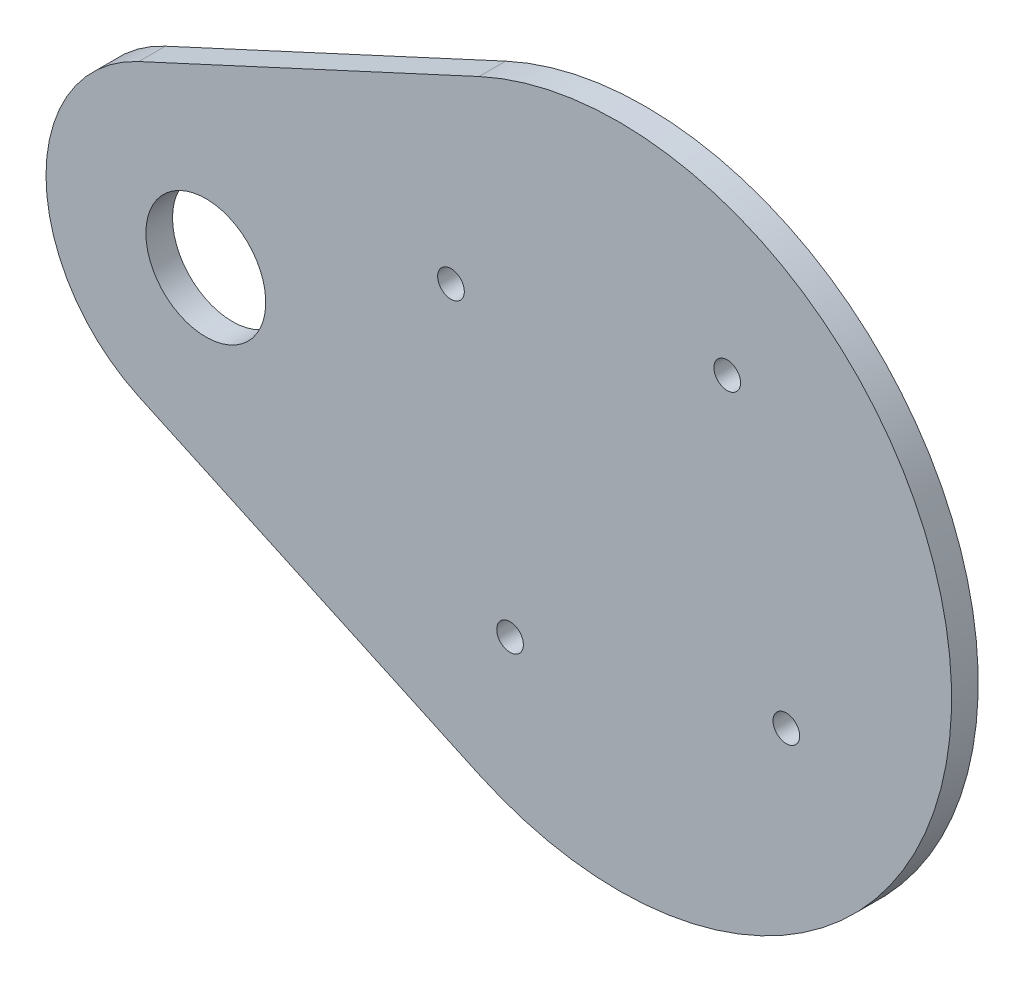
ISO-10303-21;
HEADER;
FILE_DESCRIPTION(('STEP AP214'),'2;1');
FILE_NAME('part.step','',(''),(''),'','','');
FILE_SCHEMA(('AUTOMOTIVE_DESIGN { 1 0 10303 214 1 1 1 1 }'));
ENDSEC;
DATA;
#1=APPLICATION_CONTEXT('core data for automotive mechanical design processes');
#2=APPLICATION_PROTOCOL_DEFINITION('international standard','automotive_design',2000,#1);
#3=PRODUCT_CONTEXT('',#1,'mechanical');
#4=PRODUCT('Part','Part','',(#3));
#5=PRODUCT_RELATED_PRODUCT_CATEGORY('part','',(#4));
#6=PRODUCT_DEFINITION_FORMATION('','',#4);
#7=PRODUCT_DEFINITION_CONTEXT('part definition',#1,'design');
#8=PRODUCT_DEFINITION('design','',#6,#7);
#9=PRODUCT_DEFINITION_SHAPE('','',#8);
#10=(LENGTH_UNIT() NAMED_UNIT(*) SI_UNIT(.MILLI.,.METRE.));
#11=(NAMED_UNIT(*) PLANE_ANGLE_UNIT() SI_UNIT($,.RADIAN.));
#12=(NAMED_UNIT(*) SI_UNIT($,.STERADIAN.) SOLID_ANGLE_UNIT());
#13=UNCERTAINTY_MEASURE_WITH_UNIT(LENGTH_MEASURE(1.E-05),#10,'distance_accuracy_value','');
#14=(GEOMETRIC_REPRESENTATION_CONTEXT(3) GLOBAL_UNCERTAINTY_ASSIGNED_CONTEXT((#13)) GLOBAL_UNIT_ASSIGNED_CONTEXT((#10,
#11,#12)) REPRESENTATION_CONTEXT('',''));
#15=CARTESIAN_POINT('',(0.,0.,0.));
#16=DIRECTION('',(0.,0.,1.));
#17=DIRECTION('',(1.,0.,0.));
#18=AXIS2_PLACEMENT_3D('',#15,#16,#17);
#19=CARTESIAN_POINT('',(-10.4838709677419,22.6955601281779,86.4037913840368));
#20=DIRECTION('',(0.419354838709677,-0.907822405127116,0.));
#21=DIRECTION('',(0.907822405127116,0.419354838709677,0.));
#22=AXIS2_PLACEMENT_3D('',#19,#20,#21);
#23=PLANE('',#22);
#24=DIRECTION('',(0.,0.,-1.));
#25=VECTOR('',#24,1.);
#26=CARTESIAN_POINT('',(-36.0322580645161,10.8938688615254,86.4037913840368));
#27=LINE('',#26,#25);
#28=CARTESIAN_POINT('',(-36.0322580645163,10.8938688615257,2.00000000000001));
#29=VERTEX_POINT('',#28);
#30=CARTESIAN_POINT('',(-36.0322580645161,10.8938688615254,0.));
#31=VERTEX_POINT('',#30);
#32=EDGE_CURVE('E77',#29,#31,#27,.T.);
#33=ORIENTED_EDGE('',*,*,#32,.F.);
#34=DIRECTION('',(0.907822405127116,0.419354838709677,0.));
#35=VECTOR('',#34,1.);
#36=CARTESIAN_POINT('',(-10.4838709677419,22.6955601281779,2.00000000000002));
#37=LINE('',#36,#35);
#38=CARTESIAN_POINT('',(-10.4838709677419,22.6955601281779,2.00000000000001));
#39=VERTEX_POINT('',#38);
#40=EDGE_CURVE('E52',#29,#39,#37,.T.);
#41=ORIENTED_EDGE('',*,*,#40,.T.);
#42=DIRECTION('',(0.,0.,-1.));
#43=VECTOR('',#42,1.);
#44=CARTESIAN_POINT('',(-10.4838709677419,22.6955601281779,86.4037913840368));
#45=LINE('',#44,#43);
#46=CARTESIAN_POINT('',(-10.4838709677419,22.6955601281779,0.));
#47=VERTEX_POINT('',#46);
#48=EDGE_CURVE('E96',#39,#47,#45,.T.);
#49=ORIENTED_EDGE('',*,*,#48,.T.);
#50=DIRECTION('',(-0.907822405127116,-0.419354838709677,0.));
#51=VECTOR('',#50,1.);
#52=CARTESIAN_POINT('',(-10.4838709677419,22.6955601281779,0.));
#53=LINE('',#52,#51);
#54=EDGE_CURVE('E91',#47,#31,#53,.T.);
#55=ORIENTED_EDGE('',*,*,#54,.T.);
#56=EDGE_LOOP('',(#33,#41,#49,#55));
#57=FACE_BOUND('',#56,.T.);
#58=ADVANCED_FACE('F35',(#57),#23,.F.);
#59=CARTESIAN_POINT('',(-31.,3.46166715664416E-13,86.4037913840368));
#60=DIRECTION('',(0.,0.,-1.));
#61=DIRECTION('',(-1.,0.,0.));
#62=AXIS2_PLACEMENT_3D('',#59,#60,#61);
#63=CYLINDRICAL_SURFACE('',#62,12.);
#64=DIRECTION('',(0.,0.,-1.));
#65=VECTOR('',#64,1.);
#66=CARTESIAN_POINT('',(-36.0322580645161,-10.8938688615254,86.4037913840368));
#67=LINE('',#66,#65);
#68=CARTESIAN_POINT('',(-36.0322580645161,-10.8938688615254,2.00000000000001));
#69=VERTEX_POINT('',#68);
#70=CARTESIAN_POINT('',(-36.0322580645161,-10.8938688615254,0.));
#71=VERTEX_POINT('',#70);
#72=EDGE_CURVE('E72',#69,#71,#67,.T.);
#73=ORIENTED_EDGE('',*,*,#72,.F.);
#74=CARTESIAN_POINT('',(-31.,3.46166715664416E-13,2.00000000000002));
#75=DIRECTION('',(0.,0.,-1.));
#76=DIRECTION('',(-1.,0.,0.));
#77=AXIS2_PLACEMENT_3D('',#74,#75,#76);
#78=CIRCLE('',#77,12.);
#79=EDGE_CURVE('E82',#69,#29,#78,.T.);
#80=ORIENTED_EDGE('',*,*,#79,.T.);
#81=ORIENTED_EDGE('',*,*,#32,.T.);
#82=CARTESIAN_POINT('',(-31.,3.46166715664416E-13,0.));
#83=DIRECTION('',(0.,0.,1.));
#84=DIRECTION('',(1.,0.,0.));
#85=AXIS2_PLACEMENT_3D('',#82,#83,#84);
#86=CIRCLE('',#85,12.);
#87=EDGE_CURVE('E80',#31,#71,#86,.T.);
#88=ORIENTED_EDGE('',*,*,#87,.T.);
#89=EDGE_LOOP('',(#73,#80,#81,#88));
#90=FACE_BOUND('',#89,.T.);
#91=ADVANCED_FACE('F79',(#90),#63,.T.);
#92=CARTESIAN_POINT('',(-10.4838709677419,-22.6955601281779,86.4037913840368));
#93=DIRECTION('',(0.419354838709678,0.907822405127115,0.));
#94=DIRECTION('',(-0.907822405127115,0.419354838709678,0.));
#95=AXIS2_PLACEMENT_3D('',#92,#93,#94);
#96=PLANE('',#95);
#97=DIRECTION('',(0.,0.,-1.));
#98=VECTOR('',#97,1.);
#99=CARTESIAN_POINT('',(-10.4838709677419,-22.6955601281779,86.4037913840368));
#100=LINE('',#99,#98);
#101=CARTESIAN_POINT('',(-10.4838709677419,-22.6955601281779,2.00000000000002));
#102=VERTEX_POINT('',#101);
#103=CARTESIAN_POINT('',(-10.4838709677419,-22.6955601281779,0.));
#104=VERTEX_POINT('',#103);
#105=EDGE_CURVE('E129',#102,#104,#100,.T.);
#106=ORIENTED_EDGE('',*,*,#105,.F.);
#107=DIRECTION('',(-0.907822405127115,0.419354838709678,0.));
#108=VECTOR('',#107,1.);
#109=CARTESIAN_POINT('',(-10.4838709677419,-22.6955601281779,2.00000000000002));
#110=LINE('',#109,#108);
#111=EDGE_CURVE('E93',#102,#69,#110,.T.);
#112=ORIENTED_EDGE('',*,*,#111,.T.);
#113=ORIENTED_EDGE('',*,*,#72,.T.);
#114=DIRECTION('',(0.907822405127115,-0.419354838709678,0.));
#115=VECTOR('',#114,1.);
#116=CARTESIAN_POINT('',(-10.4838709677419,-22.6955601281779,0.));
#117=LINE('',#116,#115);
#118=EDGE_CURVE('E92',#71,#104,#117,.T.);
#119=ORIENTED_EDGE('',*,*,#118,.T.);
#120=EDGE_LOOP('',(#106,#112,#113,#119));
#121=FACE_BOUND('',#120,.T.);
#122=ADVANCED_FACE('F160',(#121),#96,.F.);
#123=CARTESIAN_POINT('',(0.,0.,86.4037913840368));
#124=DIRECTION('',(0.,0.,-1.));
#125=DIRECTION('',(-1.,0.,0.));
#126=AXIS2_PLACEMENT_3D('',#123,#124,#125);
#127=CYLINDRICAL_SURFACE('',#126,25.);
#128=ORIENTED_EDGE('',*,*,#48,.F.);
#129=CARTESIAN_POINT('',(0.,0.,2.00000000000002));
#130=DIRECTION('',(0.,0.,-1.));
#131=DIRECTION('',(-1.,0.,0.));
#132=AXIS2_PLACEMENT_3D('',#129,#130,#131);
#133=CIRCLE('',#132,25.);
#134=EDGE_CURVE('E130',#39,#102,#133,.T.);
#135=ORIENTED_EDGE('',*,*,#134,.T.);
#136=ORIENTED_EDGE('',*,*,#105,.T.);
#137=CARTESIAN_POINT('',(0.,0.,0.));
#138=DIRECTION('',(0.,0.,1.));
#139=DIRECTION('',(1.,0.,0.));
#140=AXIS2_PLACEMENT_3D('',#137,#138,#139);
#141=CIRCLE('',#140,25.);
#142=EDGE_CURVE('E121',#104,#47,#141,.T.);
#143=ORIENTED_EDGE('',*,*,#142,.T.);
#144=EDGE_LOOP('',(#128,#135,#136,#143));
#145=FACE_BOUND('',#144,.T.);
#146=ADVANCED_FACE('F168',(#145),#127,.T.);
#147=CARTESIAN_POINT('',(-12.5899519946088,8.15433067599406,86.4037913840368));
#148=DIRECTION('',(0.,0.,-1.));
#149=DIRECTION('',(-1.,0.,0.));
#150=AXIS2_PLACEMENT_3D('',#147,#148,#149);
#151=CYLINDRICAL_SURFACE('',#150,1.00000000000058);
#152=CARTESIAN_POINT('',(-12.5899519946088,8.15433067599406,2.00000000000002));
#153=DIRECTION('',(0.,0.,-1.));
#154=DIRECTION('',(-1.,0.,0.));
#155=AXIS2_PLACEMENT_3D('',#152,#153,#154);
#156=CIRCLE('',#155,1.00000000000058);
#157=CARTESIAN_POINT('',(-13.5899519946094,8.15433067599406,2.00000000000002));
#158=VERTEX_POINT('',#157);
#159=EDGE_CURVE('E107',#158,#158,#156,.F.);
#160=ORIENTED_EDGE('',*,*,#159,.T.);
#161=EDGE_LOOP('',(#160));
#162=FACE_BOUND('',#161,.T.);
#163=CARTESIAN_POINT('',(-12.5899519946088,8.15433067599406,0.));
#164=DIRECTION('',(0.,0.,1.));
#165=DIRECTION('',(1.,0.,0.));
#166=AXIS2_PLACEMENT_3D('',#163,#164,#165);
#167=CIRCLE('',#166,1.00000000000058);
#168=CARTESIAN_POINT('',(-11.5899519946083,8.15433067599406,0.));
#169=VERTEX_POINT('',#168);
#170=EDGE_CURVE('E103',#169,#169,#167,.F.);
#171=ORIENTED_EDGE('',*,*,#170,.T.);
#172=EDGE_LOOP('',(#171));
#173=FACE_BOUND('',#172,.T.);
#174=ADVANCED_FACE('F164',(#162,#173),#151,.F.);
#175=CARTESIAN_POINT('',(12.5899519946081,-8.1543306759936,86.4037913840368));
#176=DIRECTION('',(0.,0.,-1.));
#177=DIRECTION('',(-1.,0.,0.));
#178=AXIS2_PLACEMENT_3D('',#175,#176,#177);
#179=CYLINDRICAL_SURFACE('',#178,1.00000000000045);
#180=CARTESIAN_POINT('',(12.5899519946081,-8.1543306759936,2.00000000000003));
#181=DIRECTION('',(0.,0.,-1.));
#182=DIRECTION('',(-1.,0.,0.));
#183=AXIS2_PLACEMENT_3D('',#180,#181,#182);
#184=CIRCLE('',#183,1.00000000000045);
#185=CARTESIAN_POINT('',(11.5899519946077,-8.1543306759936,2.00000000000003));
#186=VERTEX_POINT('',#185);
#187=EDGE_CURVE('E106',#186,#186,#184,.F.);
#188=ORIENTED_EDGE('',*,*,#187,.T.);
#189=EDGE_LOOP('',(#188));
#190=FACE_BOUND('',#189,.T.);
#191=CARTESIAN_POINT('',(12.5899519946081,-8.1543306759936,0.));
#192=DIRECTION('',(0.,0.,1.));
#193=DIRECTION('',(1.,0.,0.));
#194=AXIS2_PLACEMENT_3D('',#191,#192,#193);
#195=CIRCLE('',#194,1.00000000000045);
#196=CARTESIAN_POINT('',(13.5899519946086,-8.1543306759936,0.));
#197=VERTEX_POINT('',#196);
#198=EDGE_CURVE('E108',#197,#197,#195,.F.);
#199=ORIENTED_EDGE('',*,*,#198,.T.);
#200=EDGE_LOOP('',(#199));
#201=FACE_BOUND('',#200,.T.);
#202=ADVANCED_FACE('F167',(#190,#201),#179,.F.);
#203=CARTESIAN_POINT('',(-8.15433067599419,-12.5899519946083,86.4037913840368));
#204=DIRECTION('',(0.,0.,-1.));
#205=DIRECTION('',(-1.,0.,0.));
#206=AXIS2_PLACEMENT_3D('',#203,#204,#205);
#207=CYLINDRICAL_SURFACE('',#206,1.00000000000093);
#208=CARTESIAN_POINT('',(-8.15433067599419,-12.5899519946083,2.00000000000002));
#209=DIRECTION('',(0.,0.,-1.));
#210=DIRECTION('',(-1.,0.,0.));
#211=AXIS2_PLACEMENT_3D('',#208,#209,#210);
#212=CIRCLE('',#211,1.00000000000093);
#213=CARTESIAN_POINT('',(-9.15433067599512,-12.5899519946083,2.00000000000002));
#214=VERTEX_POINT('',#213);
#215=EDGE_CURVE('E111',#214,#214,#212,.F.);
#216=ORIENTED_EDGE('',*,*,#215,.T.);
#217=EDGE_LOOP('',(#216));
#218=FACE_BOUND('',#217,.T.);
#219=CARTESIAN_POINT('',(-8.15433067599419,-12.5899519946083,0.));
#220=DIRECTION('',(0.,0.,1.));
#221=DIRECTION('',(1.,0.,0.));
#222=AXIS2_PLACEMENT_3D('',#219,#220,#221);
#223=CIRCLE('',#222,1.00000000000093);
#224=CARTESIAN_POINT('',(-7.15433067599326,-12.5899519946083,0.));
#225=VERTEX_POINT('',#224);
#226=EDGE_CURVE('E112',#225,#225,#223,.F.);
#227=ORIENTED_EDGE('',*,*,#226,.T.);
#228=EDGE_LOOP('',(#227));
#229=FACE_BOUND('',#228,.T.);
#230=ADVANCED_FACE('F151',(#218,#229),#207,.F.);
#231=CARTESIAN_POINT('',(8.15433067599347,12.5899519946087,86.4037913840368));
#232=DIRECTION('',(0.,0.,-1.));
#233=DIRECTION('',(-1.,0.,0.));
#234=AXIS2_PLACEMENT_3D('',#231,#232,#233);
#235=CYLINDRICAL_SURFACE('',#234,1.);
#236=CARTESIAN_POINT('',(8.15433067599347,12.5899519946087,2.00000000000002));
#237=DIRECTION('',(0.,0.,-1.));
#238=DIRECTION('',(-1.,0.,0.));
#239=AXIS2_PLACEMENT_3D('',#236,#237,#238);
#240=CIRCLE('',#239,1.);
#241=CARTESIAN_POINT('',(7.15433067599347,12.5899519946087,2.00000000000002));
#242=VERTEX_POINT('',#241);
#243=EDGE_CURVE('E115',#242,#242,#240,.F.);
#244=ORIENTED_EDGE('',*,*,#243,.T.);
#245=EDGE_LOOP('',(#244));
#246=FACE_BOUND('',#245,.T.);
#247=CARTESIAN_POINT('',(8.15433067599347,12.5899519946087,0.));
#248=DIRECTION('',(0.,0.,1.));
#249=DIRECTION('',(1.,0.,0.));
#250=AXIS2_PLACEMENT_3D('',#247,#248,#249);
#251=CIRCLE('',#250,1.);
#252=CARTESIAN_POINT('',(9.15433067599347,12.5899519946087,0.));
#253=VERTEX_POINT('',#252);
#254=EDGE_CURVE('E116',#253,#253,#251,.F.);
#255=ORIENTED_EDGE('',*,*,#254,.T.);
#256=EDGE_LOOP('',(#255));
#257=FACE_BOUND('',#256,.T.);
#258=ADVANCED_FACE('F143',(#246,#257),#235,.F.);
#259=CARTESIAN_POINT('',(-31.0000000000008,-1.76703497826625E-13,86.4037913840368));
#260=DIRECTION('',(0.,0.,-1.));
#261=DIRECTION('',(-1.,0.,0.));
#262=AXIS2_PLACEMENT_3D('',#259,#260,#261);
#263=CYLINDRICAL_SURFACE('',#262,4.5);
#264=CARTESIAN_POINT('',(-31.0000000000008,-1.76703497826625E-13,2.00000000000002));
#265=DIRECTION('',(0.,0.,-1.));
#266=DIRECTION('',(-1.,0.,0.));
#267=AXIS2_PLACEMENT_3D('',#264,#265,#266);
#268=CIRCLE('',#267,4.5);
#269=CARTESIAN_POINT('',(-35.5000000000008,-1.76703497826625E-13,2.00000000000002));
#270=VERTEX_POINT('',#269);
#271=EDGE_CURVE('E11',#270,#270,#268,.T.);
#272=ORIENTED_EDGE('',*,*,#271,.F.);
#273=EDGE_LOOP('',(#272));
#274=FACE_BOUND('',#273,.T.);
#275=CARTESIAN_POINT('',(-31.0000000000008,-1.76703497826625E-13,0.));
#276=DIRECTION('',(0.,0.,1.));
#277=DIRECTION('',(1.,0.,0.));
#278=AXIS2_PLACEMENT_3D('',#275,#276,#277);
#279=CIRCLE('',#278,4.5);
#280=CARTESIAN_POINT('',(-26.5000000000008,-1.76703497826625E-13,0.));
#281=VERTEX_POINT('',#280);
#282=EDGE_CURVE('E44',#281,#281,#279,.T.);
#283=ORIENTED_EDGE('',*,*,#282,.F.);
#284=EDGE_LOOP('',(#283));
#285=FACE_BOUND('',#284,.T.);
#286=ADVANCED_FACE('F141',(#274,#285),#263,.F.);
#287=CARTESIAN_POINT('',(0.,0.,0.));
#288=DIRECTION('',(0.,0.,1.));
#289=DIRECTION('',(1.,0.,0.));
#290=AXIS2_PLACEMENT_3D('',#287,#288,#289);
#291=PLANE('',#290);
#292=ORIENTED_EDGE('',*,*,#254,.F.);
#293=EDGE_LOOP('',(#292));
#294=FACE_BOUND('',#293,.T.);
#295=ORIENTED_EDGE('',*,*,#226,.F.);
#296=EDGE_LOOP('',(#295));
#297=FACE_BOUND('',#296,.T.);
#298=ORIENTED_EDGE('',*,*,#198,.F.);
#299=EDGE_LOOP('',(#298));
#300=FACE_BOUND('',#299,.T.);
#301=ORIENTED_EDGE('',*,*,#170,.F.);
#302=EDGE_LOOP('',(#301));
#303=FACE_BOUND('',#302,.T.);
#304=ORIENTED_EDGE('',*,*,#54,.F.);
#305=ORIENTED_EDGE('',*,*,#142,.F.);
#306=ORIENTED_EDGE('',*,*,#118,.F.);
#307=ORIENTED_EDGE('',*,*,#87,.F.);
#308=EDGE_LOOP('',(#304,#305,#306,#307));
#309=FACE_BOUND('',#308,.T.);
#310=ORIENTED_EDGE('',*,*,#282,.T.);
#311=EDGE_LOOP('',(#310));
#312=FACE_BOUND('',#311,.T.);
#313=ADVANCED_FACE('F88',(#294,#297,#300,#303,#309,#312),#291,.F.);
#314=CARTESIAN_POINT('',(-35.1980520109122,1.62060461361862,2.00000000000002));
#315=DIRECTION('',(0.,0.,-1.));
#316=DIRECTION('',(-0.932900446869206,0.360134358581954,0.));
#317=AXIS2_PLACEMENT_3D('',#314,#315,#316);
#318=PLANE('',#317);
#319=ORIENTED_EDGE('',*,*,#159,.F.);
#320=EDGE_LOOP('',(#319));
#321=FACE_BOUND('',#320,.T.);
#322=ORIENTED_EDGE('',*,*,#215,.F.);
#323=EDGE_LOOP('',(#322));
#324=FACE_BOUND('',#323,.T.);
#325=ORIENTED_EDGE('',*,*,#271,.T.);
#326=EDGE_LOOP('',(#325));
#327=FACE_BOUND('',#326,.T.);
#328=ORIENTED_EDGE('',*,*,#243,.F.);
#329=EDGE_LOOP('',(#328));
#330=FACE_BOUND('',#329,.T.);
#331=ORIENTED_EDGE('',*,*,#187,.F.);
#332=EDGE_LOOP('',(#331));
#333=FACE_BOUND('',#332,.T.);
#334=ORIENTED_EDGE('',*,*,#79,.F.);
#335=ORIENTED_EDGE('',*,*,#111,.F.);
#336=ORIENTED_EDGE('',*,*,#134,.F.);
#337=ORIENTED_EDGE('',*,*,#40,.F.);
#338=EDGE_LOOP('',(#334,#335,#336,#337));
#339=FACE_BOUND('',#338,.T.);
#340=ADVANCED_FACE('F37',(#321,#324,#327,#330,#333,#339),#318,.F.);
#341=CLOSED_SHELL('',(#58,#91,#122,#146,#174,#202,#230,#258,#286,#313,#340));
#342=MANIFOLD_SOLID_BREP('B2',#341);
#343=ADVANCED_BREP_SHAPE_REPRESENTATION('',(#18,#342),#14);
#344=SHAPE_DEFINITION_REPRESENTATION(#9,#343);
ENDSEC;
END-ISO-10303-21;
